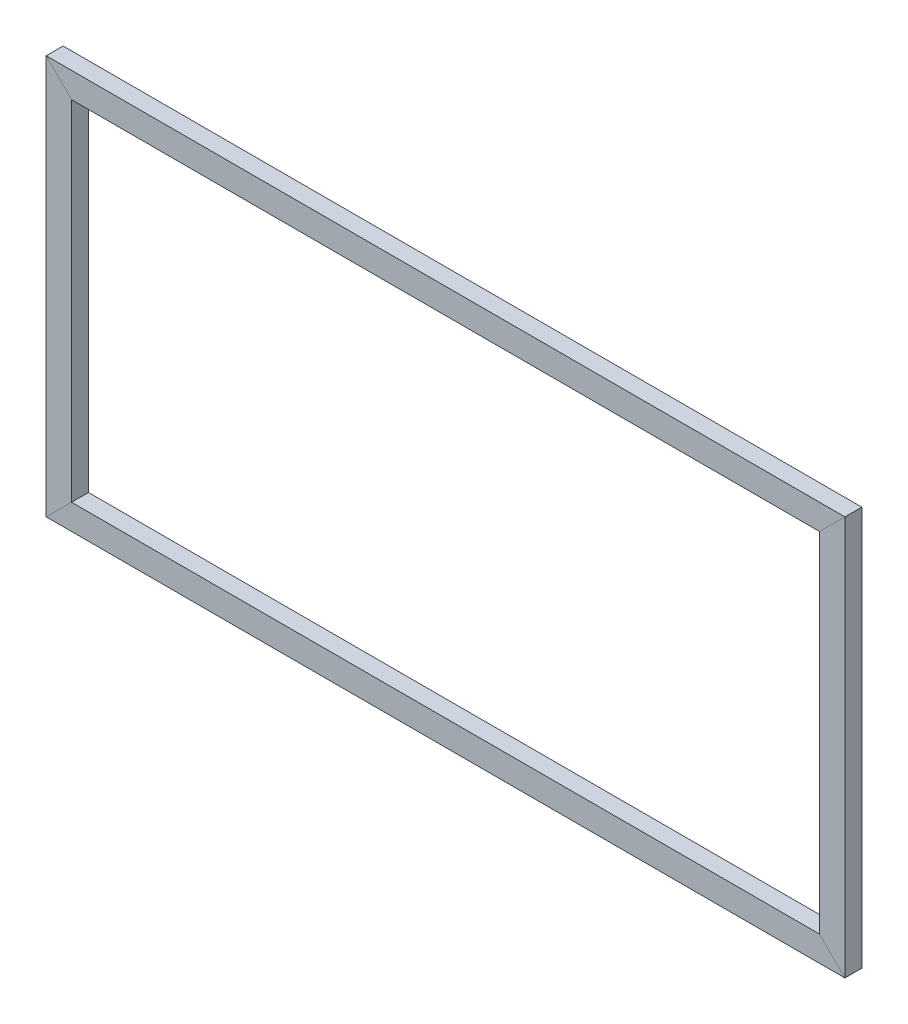
ISO-10303-21;
HEADER;
FILE_DESCRIPTION(('STEP AP214'),'2;1');
FILE_NAME('part.step','',(''),(''),'','','');
FILE_SCHEMA(('AUTOMOTIVE_DESIGN { 1 0 10303 214 1 1 1 1 }'));
ENDSEC;
DATA;
#1=APPLICATION_CONTEXT('core data for automotive mechanical design processes');
#2=APPLICATION_PROTOCOL_DEFINITION('international standard','automotive_design',2000,#1);
#3=PRODUCT_CONTEXT('',#1,'mechanical');
#4=PRODUCT('Part','Part','',(#3));
#5=PRODUCT_RELATED_PRODUCT_CATEGORY('part','',(#4));
#6=PRODUCT_DEFINITION_FORMATION('','',#4);
#7=PRODUCT_DEFINITION_CONTEXT('part definition',#1,'design');
#8=PRODUCT_DEFINITION('design','',#6,#7);
#9=PRODUCT_DEFINITION_SHAPE('','',#8);
#10=(LENGTH_UNIT() NAMED_UNIT(*) SI_UNIT(.MILLI.,.METRE.));
#11=(NAMED_UNIT(*) PLANE_ANGLE_UNIT() SI_UNIT($,.RADIAN.));
#12=(NAMED_UNIT(*) SI_UNIT($,.STERADIAN.) SOLID_ANGLE_UNIT());
#13=UNCERTAINTY_MEASURE_WITH_UNIT(LENGTH_MEASURE(1.E-05),#10,'distance_accuracy_value','');
#14=(GEOMETRIC_REPRESENTATION_CONTEXT(3) GLOBAL_UNCERTAINTY_ASSIGNED_CONTEXT((#13)) GLOBAL_UNIT_ASSIGNED_CONTEXT((#10,
#11,#12)) REPRESENTATION_CONTEXT('',''));
#15=CARTESIAN_POINT('',(0.,0.,0.));
#16=DIRECTION('',(0.,0.,1.));
#17=DIRECTION('',(1.,0.,0.));
#18=AXIS2_PLACEMENT_3D('',#15,#16,#17);
#19=CARTESIAN_POINT('',(-290.475,-130.95,6.35));
#20=DIRECTION('',(0.,-1.,0.));
#21=DIRECTION('',(1.,0.,0.));
#22=AXIS2_PLACEMENT_3D('',#19,#20,#21);
#23=PLANE('',#22);
#24=DIRECTION('',(0.,0.,1.));
#25=VECTOR('',#24,1.);
#26=CARTESIAN_POINT('',(280.95,-130.95,6.35));
#27=LINE('',#26,#25);
#28=CARTESIAN_POINT('',(280.95,-130.95,-6.35));
#29=VERTEX_POINT('',#28);
#30=CARTESIAN_POINT('',(280.95,-130.95,6.35));
#31=VERTEX_POINT('',#30);
#32=EDGE_CURVE('E119',#29,#31,#27,.T.);
#33=ORIENTED_EDGE('',*,*,#32,.F.);
#34=DIRECTION('',(1.,0.,0.));
#35=VECTOR('',#34,1.);
#36=CARTESIAN_POINT('',(-290.475,-130.95,-6.35));
#37=LINE('',#36,#35);
#38=CARTESIAN_POINT('',(-280.95,-130.95,-6.35));
#39=VERTEX_POINT('',#38);
#40=EDGE_CURVE('E127',#39,#29,#37,.T.);
#41=ORIENTED_EDGE('',*,*,#40,.F.);
#42=DIRECTION('',(0.,0.,-1.));
#43=VECTOR('',#42,1.);
#44=CARTESIAN_POINT('',(-280.95,-130.95,6.35));
#45=LINE('',#44,#43);
#46=CARTESIAN_POINT('',(-280.95,-130.95,6.35));
#47=VERTEX_POINT('',#46);
#48=EDGE_CURVE('E111',#47,#39,#45,.T.);
#49=ORIENTED_EDGE('',*,*,#48,.F.);
#50=DIRECTION('',(1.,0.,0.));
#51=VECTOR('',#50,1.);
#52=CARTESIAN_POINT('',(-290.475,-130.95,6.35));
#53=LINE('',#52,#51);
#54=EDGE_CURVE('E68',#47,#31,#53,.T.);
#55=ORIENTED_EDGE('',*,*,#54,.T.);
#56=EDGE_LOOP('',(#33,#41,#49,#55));
#57=FACE_BOUND('',#56,.T.);
#58=ADVANCED_FACE('F64',(#57),#23,.F.);
#59=CARTESIAN_POINT('',(-290.475,-150.,-6.35));
#60=DIRECTION('',(0.,0.,1.));
#61=DIRECTION('',(0.,-1.,0.));
#62=AXIS2_PLACEMENT_3D('',#59,#60,#61);
#63=PLANE('',#62);
#64=DIRECTION('',(-0.707106781186547,0.707106781186548,0.));
#65=VECTOR('',#64,1.);
#66=CARTESIAN_POINT('',(4.7625,145.2375,-6.34999999999997));
#67=LINE('',#66,#65);
#68=CARTESIAN_POINT('',(300.,-150.,-6.35));
#69=VERTEX_POINT('',#68);
#70=EDGE_CURVE('E116',#69,#29,#67,.T.);
#71=ORIENTED_EDGE('',*,*,#70,.F.);
#72=DIRECTION('',(1.,0.,0.));
#73=VECTOR('',#72,1.);
#74=CARTESIAN_POINT('',(-290.475,-150.,-6.35));
#75=LINE('',#74,#73);
#76=CARTESIAN_POINT('',(-300.,-150.,-6.35));
#77=VERTEX_POINT('',#76);
#78=EDGE_CURVE('E105',#77,#69,#75,.T.);
#79=ORIENTED_EDGE('',*,*,#78,.F.);
#80=DIRECTION('',(-0.707106781186548,-0.707106781186547,0.));
#81=VECTOR('',#80,1.);
#82=CARTESIAN_POINT('',(-295.2375,-145.2375,-6.35));
#83=LINE('',#82,#81);
#84=EDGE_CURVE('E115',#39,#77,#83,.T.);
#85=ORIENTED_EDGE('',*,*,#84,.F.);
#86=ORIENTED_EDGE('',*,*,#40,.T.);
#87=EDGE_LOOP('',(#71,#79,#85,#86));
#88=FACE_BOUND('',#87,.T.);
#89=ADVANCED_FACE('F138',(#88),#63,.F.);
#90=CARTESIAN_POINT('',(-290.475,-150.,6.35));
#91=DIRECTION('',(0.,1.,0.));
#92=DIRECTION('',(-1.,0.,0.));
#93=AXIS2_PLACEMENT_3D('',#90,#91,#92);
#94=PLANE('',#93);
#95=DIRECTION('',(0.,0.,-1.));
#96=VECTOR('',#95,1.);
#97=CARTESIAN_POINT('',(300.,-150.,6.35));
#98=LINE('',#97,#96);
#99=CARTESIAN_POINT('',(300.,-150.,6.35));
#100=VERTEX_POINT('',#99);
#101=EDGE_CURVE('E13',#100,#69,#98,.T.);
#102=ORIENTED_EDGE('',*,*,#101,.F.);
#103=DIRECTION('',(1.,0.,0.));
#104=VECTOR('',#103,1.);
#105=CARTESIAN_POINT('',(-290.475,-150.,6.35));
#106=LINE('',#105,#104);
#107=CARTESIAN_POINT('',(-300.,-150.,6.35));
#108=VERTEX_POINT('',#107);
#109=EDGE_CURVE('E81',#108,#100,#106,.T.);
#110=ORIENTED_EDGE('',*,*,#109,.F.);
#111=DIRECTION('',(0.,0.,1.));
#112=VECTOR('',#111,1.);
#113=CARTESIAN_POINT('',(-300.,-150.,6.35));
#114=LINE('',#113,#112);
#115=EDGE_CURVE('E101',#77,#108,#114,.T.);
#116=ORIENTED_EDGE('',*,*,#115,.F.);
#117=ORIENTED_EDGE('',*,*,#78,.T.);
#118=EDGE_LOOP('',(#102,#110,#116,#117));
#119=FACE_BOUND('',#118,.T.);
#120=ADVANCED_FACE('F98',(#119),#94,.F.);
#121=CARTESIAN_POINT('',(-290.475,-150.,6.35));
#122=DIRECTION('',(0.,0.,-1.));
#123=DIRECTION('',(0.,1.,0.));
#124=AXIS2_PLACEMENT_3D('',#121,#122,#123);
#125=PLANE('',#124);
#126=DIRECTION('',(0.707106781186547,-0.707106781186548,0.));
#127=VECTOR('',#126,1.);
#128=CARTESIAN_POINT('',(4.7625,145.2375,6.34999999999995));
#129=LINE('',#128,#127);
#130=EDGE_CURVE('E73',#31,#100,#129,.T.);
#131=ORIENTED_EDGE('',*,*,#130,.F.);
#132=ORIENTED_EDGE('',*,*,#54,.F.);
#133=DIRECTION('',(0.707106781186548,0.707106781186547,0.));
#134=VECTOR('',#133,1.);
#135=CARTESIAN_POINT('',(-295.2375,-145.2375,6.35));
#136=LINE('',#135,#134);
#137=EDGE_CURVE('E104',#108,#47,#136,.T.);
#138=ORIENTED_EDGE('',*,*,#137,.F.);
#139=ORIENTED_EDGE('',*,*,#109,.T.);
#140=EDGE_LOOP('',(#131,#132,#138,#139));
#141=FACE_BOUND('',#140,.T.);
#142=ADVANCED_FACE('F108',(#141),#125,.F.);
#143=CARTESIAN_POINT('',(-290.475,-140.475,0.));
#144=DIRECTION('',(-0.707106781186547,0.707106781186548,0.));
#145=DIRECTION('',(-0.707106781186548,-0.707106781186547,0.));
#146=AXIS2_PLACEMENT_3D('',#143,#144,#145);
#147=PLANE('',#146);
#148=ORIENTED_EDGE('',*,*,#137,.T.);
#149=ORIENTED_EDGE('',*,*,#48,.T.);
#150=ORIENTED_EDGE('',*,*,#84,.T.);
#151=ORIENTED_EDGE('',*,*,#115,.T.);
#152=EDGE_LOOP('',(#148,#149,#150,#151));
#153=FACE_BOUND('',#152,.T.);
#154=ADVANCED_FACE('F114',(#153),#147,.T.);
#155=CARTESIAN_POINT('',(290.475,-140.475,0.));
#156=DIRECTION('',(0.707106781186548,0.707106781186547,0.));
#157=DIRECTION('',(-0.707106781186547,0.707106781186548,0.));
#158=AXIS2_PLACEMENT_3D('',#155,#156,#157);
#159=PLANE('',#158);
#160=ORIENTED_EDGE('',*,*,#70,.T.);
#161=ORIENTED_EDGE('',*,*,#32,.T.);
#162=ORIENTED_EDGE('',*,*,#130,.T.);
#163=ORIENTED_EDGE('',*,*,#101,.T.);
#164=EDGE_LOOP('',(#160,#161,#162,#163));
#165=FACE_BOUND('',#164,.T.);
#166=ADVANCED_FACE('F66',(#165),#159,.T.);
#167=CLOSED_SHELL('',(#58,#89,#120,#142,#154,#166));
#168=MANIFOLD_SOLID_BREP('B2',#167);
#169=CARTESIAN_POINT('',(280.95,-140.475,6.35));
#170=DIRECTION('',(1.,0.,0.));
#171=DIRECTION('',(0.,0.,-1.));
#172=AXIS2_PLACEMENT_3D('',#169,#170,#171);
#173=PLANE('',#172);
#174=DIRECTION('',(0.,0.,-1.));
#175=VECTOR('',#174,1.);
#176=CARTESIAN_POINT('',(280.95,-130.95,6.35));
#177=LINE('',#176,#175);
#178=CARTESIAN_POINT('',(280.95,-130.95,6.35));
#179=VERTEX_POINT('',#178);
#180=CARTESIAN_POINT('',(280.95,-130.95,-6.35));
#181=VERTEX_POINT('',#180);
#182=EDGE_CURVE('E277',#179,#181,#177,.T.);
#183=ORIENTED_EDGE('',*,*,#182,.F.);
#184=DIRECTION('',(0.,1.,0.));
#185=VECTOR('',#184,1.);
#186=CARTESIAN_POINT('',(280.95,-140.475,6.35));
#187=LINE('',#186,#185);
#188=CARTESIAN_POINT('',(280.95,130.95,6.35));
#189=VERTEX_POINT('',#188);
#190=EDGE_CURVE('E232',#179,#189,#187,.T.);
#191=ORIENTED_EDGE('',*,*,#190,.T.);
#192=DIRECTION('',(0.,0.,1.));
#193=VECTOR('',#192,1.);
#194=CARTESIAN_POINT('',(280.95,130.95,6.35));
#195=LINE('',#194,#193);
#196=CARTESIAN_POINT('',(280.95,130.95,-6.35));
#197=VERTEX_POINT('',#196);
#198=EDGE_CURVE('E281',#197,#189,#195,.T.);
#199=ORIENTED_EDGE('',*,*,#198,.F.);
#200=DIRECTION('',(0.,1.,0.));
#201=VECTOR('',#200,1.);
#202=CARTESIAN_POINT('',(280.95,-140.475,-6.35));
#203=LINE('',#202,#201);
#204=EDGE_CURVE('E273',#181,#197,#203,.T.);
#205=ORIENTED_EDGE('',*,*,#204,.F.);
#206=EDGE_LOOP('',(#183,#191,#199,#205));
#207=FACE_BOUND('',#206,.T.);
#208=ADVANCED_FACE('F228',(#207),#173,.F.);
#209=CARTESIAN_POINT('',(300.,-140.475,-6.35));
#210=DIRECTION('',(0.,0.,1.));
#211=DIRECTION('',(1.,0.,0.));
#212=AXIS2_PLACEMENT_3D('',#209,#210,#211);
#213=PLANE('',#212);
#214=DIRECTION('',(0.707106781186547,-0.707106781186548,0.));
#215=VECTOR('',#214,1.);
#216=CARTESIAN_POINT('',(295.2375,-145.2375,-6.35));
#217=LINE('',#216,#215);
#218=CARTESIAN_POINT('',(300.,-150.,-6.35));
#219=VERTEX_POINT('',#218);
#220=EDGE_CURVE('E237',#181,#219,#217,.T.);
#221=ORIENTED_EDGE('',*,*,#220,.F.);
#222=ORIENTED_EDGE('',*,*,#204,.T.);
#223=DIRECTION('',(-0.707106781186548,-0.707106781186547,0.));
#224=VECTOR('',#223,1.);
#225=CARTESIAN_POINT('',(154.7625,4.76249999999995,-6.34999999999999));
#226=LINE('',#225,#224);
#227=CARTESIAN_POINT('',(300.,150.,-6.35));
#228=VERTEX_POINT('',#227);
#229=EDGE_CURVE('E289',#228,#197,#226,.T.);
#230=ORIENTED_EDGE('',*,*,#229,.F.);
#231=DIRECTION('',(0.,1.,0.));
#232=VECTOR('',#231,1.);
#233=CARTESIAN_POINT('',(300.,-140.475,-6.35));
#234=LINE('',#233,#232);
#235=EDGE_CURVE('E274',#219,#228,#234,.T.);
#236=ORIENTED_EDGE('',*,*,#235,.F.);
#237=EDGE_LOOP('',(#221,#222,#230,#236));
#238=FACE_BOUND('',#237,.T.);
#239=ADVANCED_FACE('F271',(#238),#213,.F.);
#240=CARTESIAN_POINT('',(300.,-140.475,6.35));
#241=DIRECTION('',(-1.,0.,0.));
#242=DIRECTION('',(0.,0.,1.));
#243=AXIS2_PLACEMENT_3D('',#240,#241,#242);
#244=PLANE('',#243);
#245=DIRECTION('',(0.,0.,1.));
#246=VECTOR('',#245,1.);
#247=CARTESIAN_POINT('',(300.,-150.,6.35));
#248=LINE('',#247,#246);
#249=CARTESIAN_POINT('',(300.,-150.,6.35));
#250=VERTEX_POINT('',#249);
#251=EDGE_CURVE('E62',#219,#250,#248,.T.);
#252=ORIENTED_EDGE('',*,*,#251,.F.);
#253=ORIENTED_EDGE('',*,*,#235,.T.);
#254=DIRECTION('',(0.,0.,-1.));
#255=VECTOR('',#254,1.);
#256=CARTESIAN_POINT('',(300.,150.,6.35));
#257=LINE('',#256,#255);
#258=CARTESIAN_POINT('',(300.,150.,6.35));
#259=VERTEX_POINT('',#258);
#260=EDGE_CURVE('E285',#259,#228,#257,.T.);
#261=ORIENTED_EDGE('',*,*,#260,.F.);
#262=DIRECTION('',(0.,1.,0.));
#263=VECTOR('',#262,1.);
#264=CARTESIAN_POINT('',(300.,-140.475,6.35));
#265=LINE('',#264,#263);
#266=EDGE_CURVE('E250',#250,#259,#265,.T.);
#267=ORIENTED_EDGE('',*,*,#266,.F.);
#268=EDGE_LOOP('',(#252,#253,#261,#267));
#269=FACE_BOUND('',#268,.T.);
#270=ADVANCED_FACE('F292',(#269),#244,.F.);
#271=CARTESIAN_POINT('',(300.,-140.475,6.35));
#272=DIRECTION('',(0.,0.,-1.));
#273=DIRECTION('',(-1.,0.,0.));
#274=AXIS2_PLACEMENT_3D('',#271,#272,#273);
#275=PLANE('',#274);
#276=DIRECTION('',(-0.707106781186547,0.707106781186548,0.));
#277=VECTOR('',#276,1.);
#278=CARTESIAN_POINT('',(295.2375,-145.2375,6.35));
#279=LINE('',#278,#277);
#280=EDGE_CURVE('E283',#250,#179,#279,.T.);
#281=ORIENTED_EDGE('',*,*,#280,.F.);
#282=ORIENTED_EDGE('',*,*,#266,.T.);
#283=DIRECTION('',(0.707106781186548,0.707106781186547,0.));
#284=VECTOR('',#283,1.);
#285=CARTESIAN_POINT('',(154.7625,4.76249999999995,6.34999999999997));
#286=LINE('',#285,#284);
#287=EDGE_CURVE('E298',#189,#259,#286,.T.);
#288=ORIENTED_EDGE('',*,*,#287,.F.);
#289=ORIENTED_EDGE('',*,*,#190,.F.);
#290=EDGE_LOOP('',(#281,#282,#288,#289));
#291=FACE_BOUND('',#290,.T.);
#292=ADVANCED_FACE('F302',(#291),#275,.F.);
#293=CARTESIAN_POINT('',(290.475,140.475,0.));
#294=DIRECTION('',(-0.707106781186547,0.707106781186548,0.));
#295=DIRECTION('',(-0.707106781186548,-0.707106781186547,0.));
#296=AXIS2_PLACEMENT_3D('',#293,#294,#295);
#297=PLANE('',#296);
#298=ORIENTED_EDGE('',*,*,#229,.T.);
#299=ORIENTED_EDGE('',*,*,#198,.T.);
#300=ORIENTED_EDGE('',*,*,#287,.T.);
#301=ORIENTED_EDGE('',*,*,#260,.T.);
#302=EDGE_LOOP('',(#298,#299,#300,#301));
#303=FACE_BOUND('',#302,.T.);
#304=ADVANCED_FACE('F297',(#303),#297,.T.);
#305=CARTESIAN_POINT('',(290.475,-140.475,0.));
#306=DIRECTION('',(-0.707106781186548,-0.707106781186547,0.));
#307=DIRECTION('',(0.707106781186547,-0.707106781186548,0.));
#308=AXIS2_PLACEMENT_3D('',#305,#306,#307);
#309=PLANE('',#308);
#310=ORIENTED_EDGE('',*,*,#280,.T.);
#311=ORIENTED_EDGE('',*,*,#182,.T.);
#312=ORIENTED_EDGE('',*,*,#220,.T.);
#313=ORIENTED_EDGE('',*,*,#251,.T.);
#314=EDGE_LOOP('',(#310,#311,#312,#313));
#315=FACE_BOUND('',#314,.T.);
#316=ADVANCED_FACE('F230',(#315),#309,.T.);
#317=CLOSED_SHELL('',(#208,#239,#270,#292,#304,#316));
#318=MANIFOLD_SOLID_BREP('B7',#317);
#319=CARTESIAN_POINT('',(-280.95,140.475,6.35));
#320=DIRECTION('',(-1.,0.,0.));
#321=DIRECTION('',(0.,0.,1.));
#322=AXIS2_PLACEMENT_3D('',#319,#320,#321);
#323=PLANE('',#322);
#324=DIRECTION('',(0.,0.,1.));
#325=VECTOR('',#324,1.);
#326=CARTESIAN_POINT('',(-280.95,-130.95,6.35));
#327=LINE('',#326,#325);
#328=CARTESIAN_POINT('',(-280.95,-130.95,-6.35));
#329=VERTEX_POINT('',#328);
#330=CARTESIAN_POINT('',(-280.95,-130.95,6.35));
#331=VERTEX_POINT('',#330);
#332=EDGE_CURVE('E446',#329,#331,#327,.T.);
#333=ORIENTED_EDGE('',*,*,#332,.F.);
#334=DIRECTION('',(0.,-1.,0.));
#335=VECTOR('',#334,1.);
#336=CARTESIAN_POINT('',(-280.95,140.475,-6.35));
#337=LINE('',#336,#335);
#338=CARTESIAN_POINT('',(-280.95,130.95,-6.35));
#339=VERTEX_POINT('',#338);
#340=EDGE_CURVE('E454',#339,#329,#337,.T.);
#341=ORIENTED_EDGE('',*,*,#340,.F.);
#342=DIRECTION('',(0.,0.,-1.));
#343=VECTOR('',#342,1.);
#344=CARTESIAN_POINT('',(-280.95,130.95,6.35));
#345=LINE('',#344,#343);
#346=CARTESIAN_POINT('',(-280.95,130.95,6.35));
#347=VERTEX_POINT('',#346);
#348=EDGE_CURVE('E438',#347,#339,#345,.T.);
#349=ORIENTED_EDGE('',*,*,#348,.F.);
#350=DIRECTION('',(0.,-1.,0.));
#351=VECTOR('',#350,1.);
#352=CARTESIAN_POINT('',(-280.95,140.475,6.35));
#353=LINE('',#352,#351);
#354=EDGE_CURVE('E395',#347,#331,#353,.T.);
#355=ORIENTED_EDGE('',*,*,#354,.T.);
#356=EDGE_LOOP('',(#333,#341,#349,#355));
#357=FACE_BOUND('',#356,.T.);
#358=ADVANCED_FACE('F391',(#357),#323,.F.);
#359=CARTESIAN_POINT('',(-300.,140.475,-6.35));
#360=DIRECTION('',(0.,0.,1.));
#361=DIRECTION('',(1.,0.,0.));
#362=AXIS2_PLACEMENT_3D('',#359,#360,#361);
#363=PLANE('',#362);
#364=DIRECTION('',(0.707106781186548,0.707106781186547,0.));
#365=VECTOR('',#364,1.);
#366=CARTESIAN_POINT('',(-154.7625,-4.76250000000003,-6.34999999999999));
#367=LINE('',#366,#365);
#368=CARTESIAN_POINT('',(-300.,-150.,-6.35));
#369=VERTEX_POINT('',#368);
#370=EDGE_CURVE('E443',#369,#329,#367,.T.);
#371=ORIENTED_EDGE('',*,*,#370,.F.);
#372=DIRECTION('',(0.,-1.,0.));
#373=VECTOR('',#372,1.);
#374=CARTESIAN_POINT('',(-300.,140.475,-6.35));
#375=LINE('',#374,#373);
#376=CARTESIAN_POINT('',(-300.,150.,-6.35));
#377=VERTEX_POINT('',#376);
#378=EDGE_CURVE('E432',#377,#369,#375,.T.);
#379=ORIENTED_EDGE('',*,*,#378,.F.);
#380=DIRECTION('',(-0.707106781186547,0.707106781186548,0.));
#381=VECTOR('',#380,1.);
#382=CARTESIAN_POINT('',(-295.2375,145.2375,-6.35));
#383=LINE('',#382,#381);
#384=EDGE_CURVE('E442',#339,#377,#383,.T.);
#385=ORIENTED_EDGE('',*,*,#384,.F.);
#386=ORIENTED_EDGE('',*,*,#340,.T.);
#387=EDGE_LOOP('',(#371,#379,#385,#386));
#388=FACE_BOUND('',#387,.T.);
#389=ADVANCED_FACE('F465',(#388),#363,.F.);
#390=CARTESIAN_POINT('',(-300.,140.475,6.35));
#391=DIRECTION('',(1.,0.,0.));
#392=DIRECTION('',(0.,0.,-1.));
#393=AXIS2_PLACEMENT_3D('',#390,#391,#392);
#394=PLANE('',#393);
#395=DIRECTION('',(0.,0.,-1.));
#396=VECTOR('',#395,1.);
#397=CARTESIAN_POINT('',(-300.,-150.,6.35));
#398=LINE('',#397,#396);
#399=CARTESIAN_POINT('',(-300.,-150.,6.35));
#400=VERTEX_POINT('',#399);
#401=EDGE_CURVE('E226',#400,#369,#398,.T.);
#402=ORIENTED_EDGE('',*,*,#401,.F.);
#403=DIRECTION('',(0.,-1.,0.));
#404=VECTOR('',#403,1.);
#405=CARTESIAN_POINT('',(-300.,140.475,6.35));
#406=LINE('',#405,#404);
#407=CARTESIAN_POINT('',(-300.,150.,6.35));
#408=VERTEX_POINT('',#407);
#409=EDGE_CURVE('E408',#408,#400,#406,.T.);
#410=ORIENTED_EDGE('',*,*,#409,.F.);
#411=DIRECTION('',(0.,0.,1.));
#412=VECTOR('',#411,1.);
#413=CARTESIAN_POINT('',(-300.,150.,6.35));
#414=LINE('',#413,#412);
#415=EDGE_CURVE('E428',#377,#408,#414,.T.);
#416=ORIENTED_EDGE('',*,*,#415,.F.);
#417=ORIENTED_EDGE('',*,*,#378,.T.);
#418=EDGE_LOOP('',(#402,#410,#416,#417));
#419=FACE_BOUND('',#418,.T.);
#420=ADVANCED_FACE('F425',(#419),#394,.F.);
#421=CARTESIAN_POINT('',(-300.,140.475,6.35));
#422=DIRECTION('',(0.,0.,-1.));
#423=DIRECTION('',(-1.,0.,0.));
#424=AXIS2_PLACEMENT_3D('',#421,#422,#423);
#425=PLANE('',#424);
#426=DIRECTION('',(-0.707106781186548,-0.707106781186547,0.));
#427=VECTOR('',#426,1.);
#428=CARTESIAN_POINT('',(-154.7625,-4.76250000000003,6.34999999999997));
#429=LINE('',#428,#427);
#430=EDGE_CURVE('E400',#331,#400,#429,.T.);
#431=ORIENTED_EDGE('',*,*,#430,.F.);
#432=ORIENTED_EDGE('',*,*,#354,.F.);
#433=DIRECTION('',(0.707106781186547,-0.707106781186548,0.));
#434=VECTOR('',#433,1.);
#435=CARTESIAN_POINT('',(-295.2375,145.2375,6.35));
#436=LINE('',#435,#434);
#437=EDGE_CURVE('E431',#408,#347,#436,.T.);
#438=ORIENTED_EDGE('',*,*,#437,.F.);
#439=ORIENTED_EDGE('',*,*,#409,.T.);
#440=EDGE_LOOP('',(#431,#432,#438,#439));
#441=FACE_BOUND('',#440,.T.);
#442=ADVANCED_FACE('F435',(#441),#425,.F.);
#443=CARTESIAN_POINT('',(-290.475,140.475,0.));
#444=DIRECTION('',(0.707106781186548,0.707106781186547,0.));
#445=DIRECTION('',(-0.707106781186547,0.707106781186548,0.));
#446=AXIS2_PLACEMENT_3D('',#443,#444,#445);
#447=PLANE('',#446);
#448=ORIENTED_EDGE('',*,*,#437,.T.);
#449=ORIENTED_EDGE('',*,*,#348,.T.);
#450=ORIENTED_EDGE('',*,*,#384,.T.);
#451=ORIENTED_EDGE('',*,*,#415,.T.);
#452=EDGE_LOOP('',(#448,#449,#450,#451));
#453=FACE_BOUND('',#452,.T.);
#454=ADVANCED_FACE('F441',(#453),#447,.T.);
#455=CARTESIAN_POINT('',(-290.475,-140.475,0.));
#456=DIRECTION('',(0.707106781186547,-0.707106781186548,0.));
#457=DIRECTION('',(0.707106781186548,0.707106781186547,0.));
#458=AXIS2_PLACEMENT_3D('',#455,#456,#457);
#459=PLANE('',#458);
#460=ORIENTED_EDGE('',*,*,#370,.T.);
#461=ORIENTED_EDGE('',*,*,#332,.T.);
#462=ORIENTED_EDGE('',*,*,#430,.T.);
#463=ORIENTED_EDGE('',*,*,#401,.T.);
#464=EDGE_LOOP('',(#460,#461,#462,#463));
#465=FACE_BOUND('',#464,.T.);
#466=ADVANCED_FACE('F393',(#465),#459,.T.);
#467=CLOSED_SHELL('',(#358,#389,#420,#442,#454,#466));
#468=MANIFOLD_SOLID_BREP('B56',#467);
#469=CARTESIAN_POINT('',(290.475,130.95,6.35));
#470=DIRECTION('',(0.,1.,0.));
#471=DIRECTION('',(-1.,0.,0.));
#472=AXIS2_PLACEMENT_3D('',#469,#470,#471);
#473=PLANE('',#472);
#474=DIRECTION('',(0.,0.,1.));
#475=VECTOR('',#474,1.);
#476=CARTESIAN_POINT('',(-280.95,130.95,6.35));
#477=LINE('',#476,#475);
#478=CARTESIAN_POINT('',(-280.95,130.95,-6.35));
#479=VERTEX_POINT('',#478);
#480=CARTESIAN_POINT('',(-280.95,130.95,6.35));
#481=VERTEX_POINT('',#480);
#482=EDGE_CURVE('E600',#479,#481,#477,.T.);
#483=ORIENTED_EDGE('',*,*,#482,.F.);
#484=DIRECTION('',(-1.,0.,0.));
#485=VECTOR('',#484,1.);
#486=CARTESIAN_POINT('',(290.475,130.95,-6.35));
#487=LINE('',#486,#485);
#488=CARTESIAN_POINT('',(280.95,130.95,-6.35));
#489=VERTEX_POINT('',#488);
#490=EDGE_CURVE('E608',#489,#479,#487,.T.);
#491=ORIENTED_EDGE('',*,*,#490,.F.);
#492=DIRECTION('',(0.,0.,-1.));
#493=VECTOR('',#492,1.);
#494=CARTESIAN_POINT('',(280.95,130.95,6.35));
#495=LINE('',#494,#493);
#496=CARTESIAN_POINT('',(280.95,130.95,6.35));
#497=VERTEX_POINT('',#496);
#498=EDGE_CURVE('E592',#497,#489,#495,.T.);
#499=ORIENTED_EDGE('',*,*,#498,.F.);
#500=DIRECTION('',(-1.,0.,0.));
#501=VECTOR('',#500,1.);
#502=CARTESIAN_POINT('',(290.475,130.95,6.35));
#503=LINE('',#502,#501);
#504=EDGE_CURVE('E549',#497,#481,#503,.T.);
#505=ORIENTED_EDGE('',*,*,#504,.T.);
#506=EDGE_LOOP('',(#483,#491,#499,#505));
#507=FACE_BOUND('',#506,.T.);
#508=ADVANCED_FACE('F545',(#507),#473,.F.);
#509=CARTESIAN_POINT('',(290.475,150.,-6.35));
#510=DIRECTION('',(0.,0.,1.));
#511=DIRECTION('',(0.,-1.,0.));
#512=AXIS2_PLACEMENT_3D('',#509,#510,#511);
#513=PLANE('',#512);
#514=DIRECTION('',(0.707106781186547,-0.707106781186548,0.));
#515=VECTOR('',#514,1.);
#516=CARTESIAN_POINT('',(-4.76250000000017,-145.2375,-6.34999999999997));
#517=LINE('',#516,#515);
#518=CARTESIAN_POINT('',(-300.,150.,-6.35));
#519=VERTEX_POINT('',#518);
#520=EDGE_CURVE('E597',#519,#479,#517,.T.);
#521=ORIENTED_EDGE('',*,*,#520,.F.);
#522=DIRECTION('',(-1.,0.,0.));
#523=VECTOR('',#522,1.);
#524=CARTESIAN_POINT('',(290.475,150.,-6.35));
#525=LINE('',#524,#523);
#526=CARTESIAN_POINT('',(300.,150.,-6.35));
#527=VERTEX_POINT('',#526);
#528=EDGE_CURVE('E586',#527,#519,#525,.T.);
#529=ORIENTED_EDGE('',*,*,#528,.F.);
#530=DIRECTION('',(0.707106781186548,0.707106781186547,0.));
#531=VECTOR('',#530,1.);
#532=CARTESIAN_POINT('',(295.2375,145.2375,-6.35));
#533=LINE('',#532,#531);
#534=EDGE_CURVE('E596',#489,#527,#533,.T.);
#535=ORIENTED_EDGE('',*,*,#534,.F.);
#536=ORIENTED_EDGE('',*,*,#490,.T.);
#537=EDGE_LOOP('',(#521,#529,#535,#536));
#538=FACE_BOUND('',#537,.T.);
#539=ADVANCED_FACE('F619',(#538),#513,.F.);
#540=CARTESIAN_POINT('',(290.475,150.,6.35));
#541=DIRECTION('',(0.,-1.,0.));
#542=DIRECTION('',(1.,0.,0.));
#543=AXIS2_PLACEMENT_3D('',#540,#541,#542);
#544=PLANE('',#543);
#545=DIRECTION('',(0.,0.,-1.));
#546=VECTOR('',#545,1.);
#547=CARTESIAN_POINT('',(-300.,150.,6.35));
#548=LINE('',#547,#546);
#549=CARTESIAN_POINT('',(-300.000000000001,150.,6.35));
#550=VERTEX_POINT('',#549);
#551=EDGE_CURVE('E389',#550,#519,#548,.T.);
#552=ORIENTED_EDGE('',*,*,#551,.F.);
#553=DIRECTION('',(-1.,0.,0.));
#554=VECTOR('',#553,1.);
#555=CARTESIAN_POINT('',(290.475,150.,6.35));
#556=LINE('',#555,#554);
#557=CARTESIAN_POINT('',(300.,150.,6.35));
#558=VERTEX_POINT('',#557);
#559=EDGE_CURVE('E562',#558,#550,#556,.T.);
#560=ORIENTED_EDGE('',*,*,#559,.F.);
#561=DIRECTION('',(0.,0.,1.));
#562=VECTOR('',#561,1.);
#563=CARTESIAN_POINT('',(300.,150.,6.35));
#564=LINE('',#563,#562);
#565=EDGE_CURVE('E582',#527,#558,#564,.T.);
#566=ORIENTED_EDGE('',*,*,#565,.F.);
#567=ORIENTED_EDGE('',*,*,#528,.T.);
#568=EDGE_LOOP('',(#552,#560,#566,#567));
#569=FACE_BOUND('',#568,.T.);
#570=ADVANCED_FACE('F579',(#569),#544,.F.);
#571=CARTESIAN_POINT('',(290.475,150.,6.35));
#572=DIRECTION('',(0.,0.,-1.));
#573=DIRECTION('',(0.,1.,0.));
#574=AXIS2_PLACEMENT_3D('',#571,#572,#573);
#575=PLANE('',#574);
#576=DIRECTION('',(-0.707106781186547,0.707106781186548,0.));
#577=VECTOR('',#576,1.);
#578=CARTESIAN_POINT('',(-4.76250000000017,-145.2375,6.34999999999995));
#579=LINE('',#578,#577);
#580=EDGE_CURVE('E554',#481,#550,#579,.T.);
#581=ORIENTED_EDGE('',*,*,#580,.F.);
#582=ORIENTED_EDGE('',*,*,#504,.F.);
#583=DIRECTION('',(-0.707106781186548,-0.707106781186547,0.));
#584=VECTOR('',#583,1.);
#585=CARTESIAN_POINT('',(295.2375,145.2375,6.35));
#586=LINE('',#585,#584);
#587=EDGE_CURVE('E585',#558,#497,#586,.T.);
#588=ORIENTED_EDGE('',*,*,#587,.F.);
#589=ORIENTED_EDGE('',*,*,#559,.T.);
#590=EDGE_LOOP('',(#581,#582,#588,#589));
#591=FACE_BOUND('',#590,.T.);
#592=ADVANCED_FACE('F589',(#591),#575,.F.);
#593=CARTESIAN_POINT('',(290.475,140.475,0.));
#594=DIRECTION('',(0.707106781186547,-0.707106781186548,0.));
#595=DIRECTION('',(0.707106781186548,0.707106781186547,0.));
#596=AXIS2_PLACEMENT_3D('',#593,#594,#595);
#597=PLANE('',#596);
#598=ORIENTED_EDGE('',*,*,#587,.T.);
#599=ORIENTED_EDGE('',*,*,#498,.T.);
#600=ORIENTED_EDGE('',*,*,#534,.T.);
#601=ORIENTED_EDGE('',*,*,#565,.T.);
#602=EDGE_LOOP('',(#598,#599,#600,#601));
#603=FACE_BOUND('',#602,.T.);
#604=ADVANCED_FACE('F595',(#603),#597,.T.);
#605=CARTESIAN_POINT('',(-290.475,140.475,0.));
#606=DIRECTION('',(-0.707106781186548,-0.707106781186547,0.));
#607=DIRECTION('',(0.707106781186547,-0.707106781186548,0.));
#608=AXIS2_PLACEMENT_3D('',#605,#606,#607);
#609=PLANE('',#608);
#610=ORIENTED_EDGE('',*,*,#520,.T.);
#611=ORIENTED_EDGE('',*,*,#482,.T.);
#612=ORIENTED_EDGE('',*,*,#580,.T.);
#613=ORIENTED_EDGE('',*,*,#551,.T.);
#614=EDGE_LOOP('',(#610,#611,#612,#613));
#615=FACE_BOUND('',#614,.T.);
#616=ADVANCED_FACE('F547',(#615),#609,.T.);
#617=CLOSED_SHELL('',(#508,#539,#570,#592,#604,#616));
#618=MANIFOLD_SOLID_BREP('B220',#617);
#619=ADVANCED_BREP_SHAPE_REPRESENTATION('',(#18,#168,#318,#468,#618),#14);
#620=SHAPE_DEFINITION_REPRESENTATION(#9,#619);
ENDSEC;
END-ISO-10303-21;
